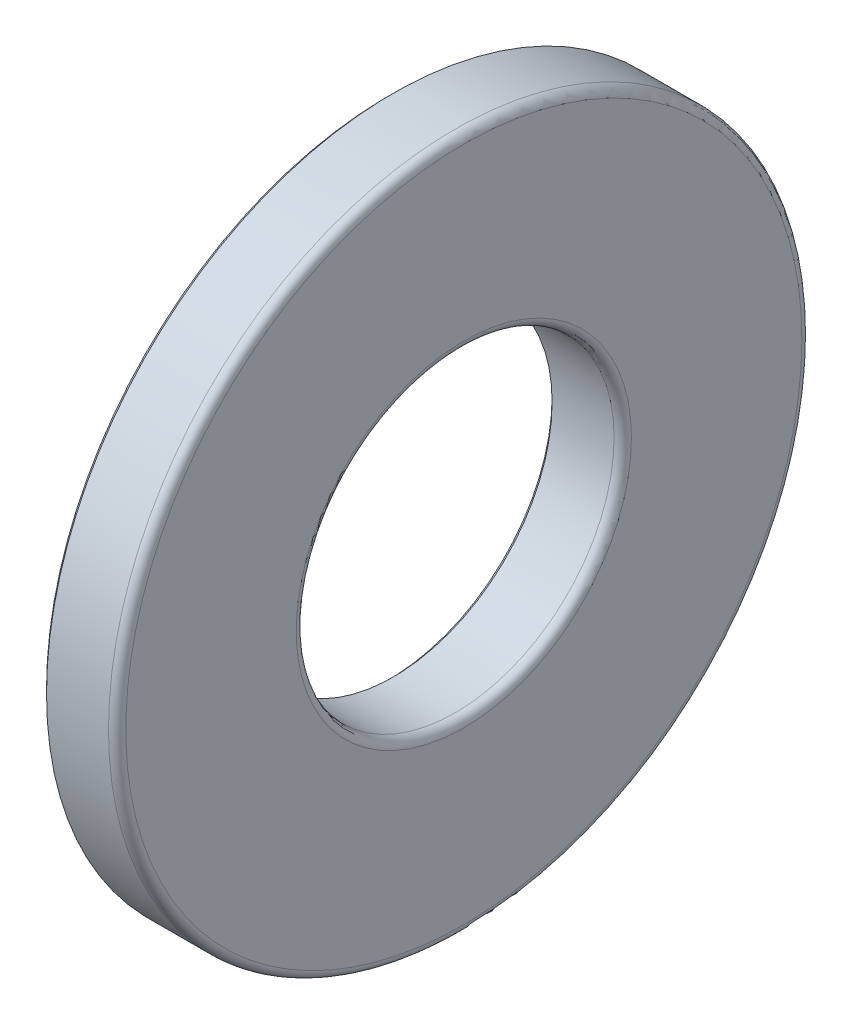
ISO-10303-21;
HEADER;
FILE_DESCRIPTION(('STEP AP214'),'2;1');
FILE_NAME('part.step','',(''),(''),'','','');
FILE_SCHEMA(('AUTOMOTIVE_DESIGN { 1 0 10303 214 1 1 1 1 }'));
ENDSEC;
DATA;
#1=APPLICATION_CONTEXT('core data for automotive mechanical design processes');
#2=APPLICATION_PROTOCOL_DEFINITION('international standard','automotive_design',2000,#1);
#3=PRODUCT_CONTEXT('',#1,'mechanical');
#4=PRODUCT('Part','Part','',(#3));
#5=PRODUCT_RELATED_PRODUCT_CATEGORY('part','',(#4));
#6=PRODUCT_DEFINITION_FORMATION('','',#4);
#7=PRODUCT_DEFINITION_CONTEXT('part definition',#1,'design');
#8=PRODUCT_DEFINITION('design','',#6,#7);
#9=PRODUCT_DEFINITION_SHAPE('','',#8);
#10=(LENGTH_UNIT() NAMED_UNIT(*) SI_UNIT(.MILLI.,.METRE.));
#11=(NAMED_UNIT(*) PLANE_ANGLE_UNIT() SI_UNIT($,.RADIAN.));
#12=(NAMED_UNIT(*) SI_UNIT($,.STERADIAN.) SOLID_ANGLE_UNIT());
#13=UNCERTAINTY_MEASURE_WITH_UNIT(LENGTH_MEASURE(1.E-05),#10,'distance_accuracy_value','');
#14=(GEOMETRIC_REPRESENTATION_CONTEXT(3) GLOBAL_UNCERTAINTY_ASSIGNED_CONTEXT((#13)) GLOBAL_UNIT_ASSIGNED_CONTEXT((#10,
#11,#12)) REPRESENTATION_CONTEXT('',''));
#15=CARTESIAN_POINT('',(0.,0.,0.));
#16=DIRECTION('',(0.,0.,1.));
#17=DIRECTION('',(1.,0.,0.));
#18=AXIS2_PLACEMENT_3D('',#15,#16,#17);
#19=CARTESIAN_POINT('',(6.4048,0.,0.));
#20=DIRECTION('',(1.,0.,0.));
#21=DIRECTION('',(0.,0.,-1.));
#22=AXIS2_PLACEMENT_3D('',#19,#20,#21);
#23=CYLINDRICAL_SURFACE('',#22,12.);
#24=CARTESIAN_POINT('',(6.55480000000001,0.,0.));
#25=DIRECTION('',(-1.,0.,0.));
#26=DIRECTION('',(0.,0.,1.));
#27=AXIS2_PLACEMENT_3D('',#24,#25,#26);
#28=CIRCLE('',#27,12.);
#29=CARTESIAN_POINT('',(6.55480000000001,0.,12.));
#30=VERTEX_POINT('',#29);
#31=EDGE_CURVE('E42',#30,#30,#28,.F.);
#32=ORIENTED_EDGE('',*,*,#31,.T.);
#33=EDGE_LOOP('',(#32));
#34=FACE_BOUND('',#33,.T.);
#35=CARTESIAN_POINT('',(8.7,0.,0.));
#36=DIRECTION('',(1.,0.,0.));
#37=DIRECTION('',(0.,0.,-1.));
#38=AXIS2_PLACEMENT_3D('',#35,#36,#37);
#39=CIRCLE('',#38,12.);
#40=CARTESIAN_POINT('',(8.7,0.,-12.));
#41=VERTEX_POINT('',#40);
#42=EDGE_CURVE('E55',#41,#41,#39,.T.);
#43=ORIENTED_EDGE('',*,*,#42,.F.);
#44=EDGE_LOOP('',(#43));
#45=FACE_BOUND('',#44,.T.);
#46=ADVANCED_FACE('F35',(#34,#45),#23,.T.);
#47=CARTESIAN_POINT('',(8.7,0.,0.));
#48=DIRECTION('',(1.,0.,0.));
#49=DIRECTION('',(0.,0.,-1.));
#50=AXIS2_PLACEMENT_3D('',#47,#48,#49);
#51=TOROIDAL_SURFACE('',#50,11.7,0.300000000000003);
#52=ORIENTED_EDGE('',*,*,#42,.T.);
#53=EDGE_LOOP('',(#52));
#54=FACE_BOUND('',#53,.T.);
#55=CARTESIAN_POINT('',(9.,0.,0.));
#56=DIRECTION('',(1.,0.,0.));
#57=DIRECTION('',(0.,0.,-1.));
#58=AXIS2_PLACEMENT_3D('',#55,#56,#57);
#59=CIRCLE('',#58,11.7);
#60=CARTESIAN_POINT('',(9.,0.,-11.7));
#61=VERTEX_POINT('',#60);
#62=EDGE_CURVE('E58',#61,#61,#59,.T.);
#63=ORIENTED_EDGE('',*,*,#62,.F.);
#64=EDGE_LOOP('',(#63));
#65=FACE_BOUND('',#64,.T.);
#66=ADVANCED_FACE('F91',(#54,#65),#51,.T.);
#67=CARTESIAN_POINT('',(9.,5.8,0.));
#68=DIRECTION('',(1.,0.,0.));
#69=DIRECTION('',(0.,0.,-1.));
#70=AXIS2_PLACEMENT_3D('',#67,#68,#69);
#71=PLANE('',#70);
#72=ORIENTED_EDGE('',*,*,#62,.T.);
#73=EDGE_LOOP('',(#72));
#74=FACE_BOUND('',#73,.T.);
#75=CARTESIAN_POINT('',(9.,0.,0.));
#76=DIRECTION('',(1.,0.,0.));
#77=DIRECTION('',(0.,0.,-1.));
#78=AXIS2_PLACEMENT_3D('',#75,#76,#77);
#79=CIRCLE('',#78,5.8);
#80=CARTESIAN_POINT('',(9.,0.,-5.8));
#81=VERTEX_POINT('',#80);
#82=EDGE_CURVE('E61',#81,#81,#79,.T.);
#83=ORIENTED_EDGE('',*,*,#82,.F.);
#84=EDGE_LOOP('',(#83));
#85=FACE_BOUND('',#84,.T.);
#86=ADVANCED_FACE('F96',(#74,#85),#71,.T.);
#87=CARTESIAN_POINT('',(8.7,0.,0.));
#88=DIRECTION('',(1.,0.,0.));
#89=DIRECTION('',(0.,0.,-1.));
#90=AXIS2_PLACEMENT_3D('',#87,#88,#89);
#91=TOROIDAL_SURFACE('',#90,5.8,0.300000000000003);
#92=ORIENTED_EDGE('',*,*,#82,.T.);
#93=EDGE_LOOP('',(#92));
#94=FACE_BOUND('',#93,.T.);
#95=CARTESIAN_POINT('',(8.7,0.,0.));
#96=DIRECTION('',(1.,0.,0.));
#97=DIRECTION('',(0.,0.,-1.));
#98=AXIS2_PLACEMENT_3D('',#95,#96,#97);
#99=CIRCLE('',#98,5.5);
#100=CARTESIAN_POINT('',(8.7,0.,-5.5));
#101=VERTEX_POINT('',#100);
#102=EDGE_CURVE('E64',#101,#101,#99,.T.);
#103=ORIENTED_EDGE('',*,*,#102,.F.);
#104=EDGE_LOOP('',(#103));
#105=FACE_BOUND('',#104,.T.);
#106=ADVANCED_FACE('F115',(#94,#105),#91,.T.);
#107=CARTESIAN_POINT('',(6.4048,0.,0.));
#108=DIRECTION('',(1.,0.,0.));
#109=DIRECTION('',(0.,0.,-1.));
#110=AXIS2_PLACEMENT_3D('',#107,#108,#109);
#111=CYLINDRICAL_SURFACE('',#110,5.5);
#112=CARTESIAN_POINT('',(6.55480000000001,0.,0.));
#113=DIRECTION('',(-1.,0.,0.));
#114=DIRECTION('',(0.,0.,1.));
#115=AXIS2_PLACEMENT_3D('',#112,#113,#114);
#116=CIRCLE('',#115,5.5);
#117=CARTESIAN_POINT('',(6.55480000000001,0.,5.5));
#118=VERTEX_POINT('',#117);
#119=EDGE_CURVE('E46',#118,#118,#116,.T.);
#120=ORIENTED_EDGE('',*,*,#119,.T.);
#121=EDGE_LOOP('',(#120));
#122=FACE_BOUND('',#121,.T.);
#123=ORIENTED_EDGE('',*,*,#102,.T.);
#124=EDGE_LOOP('',(#123));
#125=FACE_BOUND('',#124,.T.);
#126=ADVANCED_FACE('F87',(#122,#125),#111,.F.);
#127=CARTESIAN_POINT('',(6.4048,7.07139999999999,0.));
#128=DIRECTION('',(-1.,0.,0.));
#129=DIRECTION('',(0.,0.,1.));
#130=AXIS2_PLACEMENT_3D('',#127,#128,#129);
#131=PLANE('',#130);
#132=CARTESIAN_POINT('',(6.4048,0.,0.));
#133=DIRECTION('',(-1.,0.,0.));
#134=DIRECTION('',(0.,0.,1.));
#135=AXIS2_PLACEMENT_3D('',#132,#133,#134);
#136=CIRCLE('',#135,5.65);
#137=CARTESIAN_POINT('',(6.4048,0.,5.65));
#138=VERTEX_POINT('',#137);
#139=EDGE_CURVE('E50',#138,#138,#136,.F.);
#140=ORIENTED_EDGE('',*,*,#139,.T.);
#141=EDGE_LOOP('',(#140));
#142=FACE_BOUND('',#141,.T.);
#143=CARTESIAN_POINT('',(6.4048,0.,0.));
#144=DIRECTION('',(1.,0.,0.));
#145=DIRECTION('',(0.,0.,-1.));
#146=AXIS2_PLACEMENT_3D('',#143,#144,#145);
#147=CIRCLE('',#146,7.07139999999999);
#148=CARTESIAN_POINT('',(6.4048,0.,-7.07139999999999));
#149=VERTEX_POINT('',#148);
#150=EDGE_CURVE('E67',#149,#149,#147,.T.);
#151=ORIENTED_EDGE('',*,*,#150,.F.);
#152=EDGE_LOOP('',(#151));
#153=FACE_BOUND('',#152,.T.);
#154=ADVANCED_FACE('F78',(#142,#153),#131,.T.);
#155=CARTESIAN_POINT('',(4.50000000000001,0.,0.));
#156=DIRECTION('',(1.,0.,0.));
#157=DIRECTION('',(0.,0.,-1.));
#158=AXIS2_PLACEMENT_3D('',#155,#156,#157);
#159=TOROIDAL_SURFACE('',#158,8.5,2.381);
#160=ORIENTED_EDGE('',*,*,#150,.T.);
#161=EDGE_LOOP('',(#160));
#162=FACE_BOUND('',#161,.T.);
#163=CARTESIAN_POINT('',(6.4048,0.,0.));
#164=DIRECTION('',(1.,0.,0.));
#165=DIRECTION('',(0.,0.,-1.));
#166=AXIS2_PLACEMENT_3D('',#163,#164,#165);
#167=CIRCLE('',#166,9.92860000000002);
#168=CARTESIAN_POINT('',(6.4048,0.,-9.92860000000002));
#169=VERTEX_POINT('',#168);
#170=EDGE_CURVE('E70',#169,#169,#167,.T.);
#171=ORIENTED_EDGE('',*,*,#170,.F.);
#172=EDGE_LOOP('',(#171));
#173=FACE_BOUND('',#172,.T.);
#174=ADVANCED_FACE('F76',(#162,#173),#159,.F.);
#175=CARTESIAN_POINT('',(6.4048,12.,0.));
#176=DIRECTION('',(-1.,0.,0.));
#177=DIRECTION('',(0.,0.,1.));
#178=AXIS2_PLACEMENT_3D('',#175,#176,#177);
#179=PLANE('',#178);
#180=CARTESIAN_POINT('',(6.4048,0.,0.));
#181=DIRECTION('',(-1.,0.,0.));
#182=DIRECTION('',(0.,0.,1.));
#183=AXIS2_PLACEMENT_3D('',#180,#181,#182);
#184=CIRCLE('',#183,11.85);
#185=CARTESIAN_POINT('',(6.4048,0.,11.85));
#186=VERTEX_POINT('',#185);
#187=EDGE_CURVE('E10',#186,#186,#184,.T.);
#188=ORIENTED_EDGE('',*,*,#187,.T.);
#189=EDGE_LOOP('',(#188));
#190=FACE_BOUND('',#189,.T.);
#191=ORIENTED_EDGE('',*,*,#170,.T.);
#192=EDGE_LOOP('',(#191));
#193=FACE_BOUND('',#192,.T.);
#194=ADVANCED_FACE('F74',(#190,#193),#179,.T.);
#195=CARTESIAN_POINT('',(6.4048,0.,0.));
#196=DIRECTION('',(-1.,0.,0.));
#197=DIRECTION('',(0.,0.,1.));
#198=AXIS2_PLACEMENT_3D('',#195,#196,#197);
#199=CONICAL_SURFACE('',#198,5.65,0.785398163397434);
#200=ORIENTED_EDGE('',*,*,#119,.F.);
#201=EDGE_LOOP('',(#200));
#202=FACE_BOUND('',#201,.T.);
#203=ORIENTED_EDGE('',*,*,#139,.F.);
#204=EDGE_LOOP('',(#203));
#205=FACE_BOUND('',#204,.T.);
#206=ADVANCED_FACE('F85',(#202,#205),#199,.F.);
#207=CARTESIAN_POINT('',(6.55480000000001,0.,0.));
#208=DIRECTION('',(1.,0.,0.));
#209=DIRECTION('',(0.,0.,-1.));
#210=AXIS2_PLACEMENT_3D('',#207,#208,#209);
#211=CONICAL_SURFACE('',#210,12.,0.785398163397454);
#212=ORIENTED_EDGE('',*,*,#187,.F.);
#213=EDGE_LOOP('',(#212));
#214=FACE_BOUND('',#213,.T.);
#215=ORIENTED_EDGE('',*,*,#31,.F.);
#216=EDGE_LOOP('',(#215));
#217=FACE_BOUND('',#216,.T.);
#218=ADVANCED_FACE('F37',(#214,#217),#211,.T.);
#219=CLOSED_SHELL('',(#46,#66,#86,#106,#126,#154,#174,#194,#206,#218));
#220=MANIFOLD_SOLID_BREP('B2',#219);
#221=ADVANCED_BREP_SHAPE_REPRESENTATION('',(#18,#220),#14);
#222=SHAPE_DEFINITION_REPRESENTATION(#9,#221);
ENDSEC;
END-ISO-10303-21;
